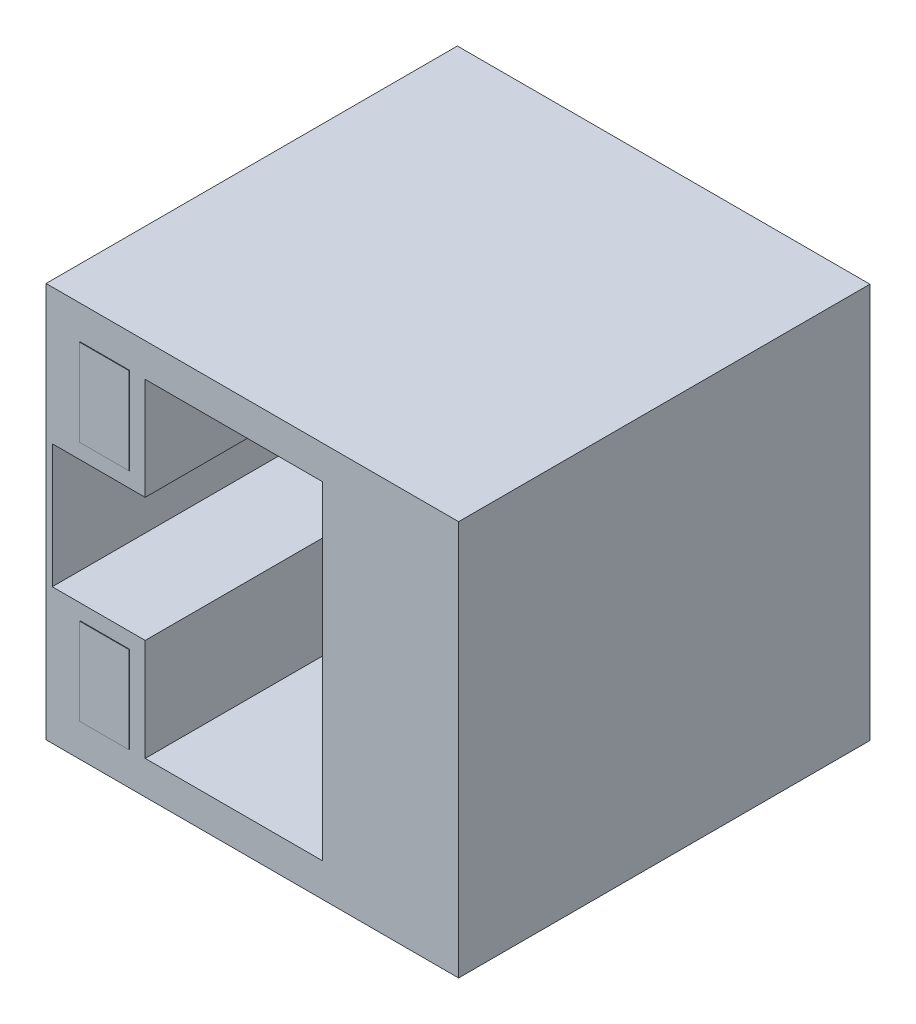
ISO-10303-21;
HEADER;
FILE_DESCRIPTION(('STEP AP214'),'2;1');
FILE_NAME('part.step','',(''),(''),'','','');
FILE_SCHEMA(('AUTOMOTIVE_DESIGN { 1 0 10303 214 1 1 1 1 }'));
ENDSEC;
DATA;
#1=APPLICATION_CONTEXT('core data for automotive mechanical design processes');
#2=APPLICATION_PROTOCOL_DEFINITION('international standard','automotive_design',2000,#1);
#3=PRODUCT_CONTEXT('',#1,'mechanical');
#4=PRODUCT('Part','Part','',(#3));
#5=PRODUCT_RELATED_PRODUCT_CATEGORY('part','',(#4));
#6=PRODUCT_DEFINITION_FORMATION('','',#4);
#7=PRODUCT_DEFINITION_CONTEXT('part definition',#1,'design');
#8=PRODUCT_DEFINITION('design','',#6,#7);
#9=PRODUCT_DEFINITION_SHAPE('','',#8);
#10=(LENGTH_UNIT() NAMED_UNIT(*) SI_UNIT(.MILLI.,.METRE.));
#11=(NAMED_UNIT(*) PLANE_ANGLE_UNIT() SI_UNIT($,.RADIAN.));
#12=(NAMED_UNIT(*) SI_UNIT($,.STERADIAN.) SOLID_ANGLE_UNIT());
#13=UNCERTAINTY_MEASURE_WITH_UNIT(LENGTH_MEASURE(1.E-05),#10,'distance_accuracy_value','');
#14=(GEOMETRIC_REPRESENTATION_CONTEXT(3) GLOBAL_UNCERTAINTY_ASSIGNED_CONTEXT((#13)) GLOBAL_UNIT_ASSIGNED_CONTEXT((#10,
#11,#12)) REPRESENTATION_CONTEXT('',''));
#15=CARTESIAN_POINT('',(0.,0.,0.));
#16=DIRECTION('',(0.,0.,1.));
#17=DIRECTION('',(1.,0.,0.));
#18=AXIS2_PLACEMENT_3D('',#15,#16,#17);
#19=CARTESIAN_POINT('',(-7.0612,-6.731,8.4582));
#20=DIRECTION('',(0.,0.,1.));
#21=DIRECTION('',(1.,0.,0.));
#22=AXIS2_PLACEMENT_3D('',#19,#20,#21);
#23=PLANE('',#22);
#24=DIRECTION('',(0.,1.,0.));
#25=VECTOR('',#24,1.);
#26=CARTESIAN_POINT('',(-7.0612,-4.953,8.4582));
#27=LINE('',#26,#25);
#28=CARTESIAN_POINT('',(-7.0612,-6.731,8.4582));
#29=VERTEX_POINT('',#28);
#30=CARTESIAN_POINT('',(-7.0612,-3.175,8.4582));
#31=VERTEX_POINT('',#30);
#32=EDGE_CURVE('E152',#29,#31,#27,.T.);
#33=ORIENTED_EDGE('',*,*,#32,.F.);
#34=DIRECTION('',(-1.,0.,0.));
#35=VECTOR('',#34,1.);
#36=CARTESIAN_POINT('',(-6.0452,-6.731,8.4582));
#37=LINE('',#36,#35);
#38=CARTESIAN_POINT('',(-5.0292,-6.731,8.4582));
#39=VERTEX_POINT('',#38);
#40=EDGE_CURVE('E154',#39,#29,#37,.T.);
#41=ORIENTED_EDGE('',*,*,#40,.F.);
#42=DIRECTION('',(0.,-1.,0.));
#43=VECTOR('',#42,1.);
#44=CARTESIAN_POINT('',(-5.0292,-4.953,8.4582));
#45=LINE('',#44,#43);
#46=CARTESIAN_POINT('',(-5.0292,-3.175,8.4582));
#47=VERTEX_POINT('',#46);
#48=EDGE_CURVE('E21',#47,#39,#45,.T.);
#49=ORIENTED_EDGE('',*,*,#48,.F.);
#50=DIRECTION('',(1.,0.,0.));
#51=VECTOR('',#50,1.);
#52=CARTESIAN_POINT('',(-6.0452,-3.175,8.4582));
#53=LINE('',#52,#51);
#54=EDGE_CURVE('E176',#31,#47,#53,.T.);
#55=ORIENTED_EDGE('',*,*,#54,.F.);
#56=EDGE_LOOP('',(#33,#41,#49,#55));
#57=FACE_BOUND('',#56,.T.);
#58=ADVANCED_FACE('F17',(#57),#23,.T.);
#59=CARTESIAN_POINT('',(-6.0452,4.953,8.4582));
#60=DIRECTION('',(0.,0.,1.));
#61=DIRECTION('',(1.,0.,0.));
#62=AXIS2_PLACEMENT_3D('',#59,#60,#61);
#63=PLANE('',#62);
#64=DIRECTION('',(0.,1.,0.));
#65=VECTOR('',#64,1.);
#66=CARTESIAN_POINT('',(-7.0612,3.175,8.4582));
#67=LINE('',#66,#65);
#68=CARTESIAN_POINT('',(-7.0612,3.175,8.4582));
#69=VERTEX_POINT('',#68);
#70=CARTESIAN_POINT('',(-7.0612,6.731,8.4582));
#71=VERTEX_POINT('',#70);
#72=EDGE_CURVE('E191',#69,#71,#67,.T.);
#73=ORIENTED_EDGE('',*,*,#72,.F.);
#74=DIRECTION('',(1.,0.,0.));
#75=VECTOR('',#74,1.);
#76=CARTESIAN_POINT('',(-5.0292,3.175,8.4582));
#77=LINE('',#76,#75);
#78=CARTESIAN_POINT('',(-5.0292,3.175,8.4582));
#79=VERTEX_POINT('',#78);
#80=EDGE_CURVE('E185',#79,#69,#77,.F.);
#81=ORIENTED_EDGE('',*,*,#80,.F.);
#82=DIRECTION('',(0.,1.,0.));
#83=VECTOR('',#82,1.);
#84=CARTESIAN_POINT('',(-5.0292,6.731,8.4582));
#85=LINE('',#84,#83);
#86=CARTESIAN_POINT('',(-5.0292,6.731,8.4582));
#87=VERTEX_POINT('',#86);
#88=EDGE_CURVE('E182',#87,#79,#85,.F.);
#89=ORIENTED_EDGE('',*,*,#88,.F.);
#90=DIRECTION('',(1.,0.,0.));
#91=VECTOR('',#90,1.);
#92=CARTESIAN_POINT('',(-7.0612,6.731,8.4582));
#93=LINE('',#92,#91);
#94=EDGE_CURVE('E197',#71,#87,#93,.T.);
#95=ORIENTED_EDGE('',*,*,#94,.F.);
#96=EDGE_LOOP('',(#73,#81,#89,#95));
#97=FACE_BOUND('',#96,.T.);
#98=ADVANCED_FACE('F504',(#97),#63,.T.);
#99=CARTESIAN_POINT('',(-2.01622360248448,0.,-1.7272));
#100=DIRECTION('',(0.,0.,1.));
#101=DIRECTION('',(1.,0.,0.));
#102=AXIS2_PLACEMENT_3D('',#99,#100,#101);
#103=PLANE('',#102);
#104=DIRECTION('',(1.,0.,0.));
#105=VECTOR('',#104,1.);
#106=CARTESIAN_POINT('',(-4.3942,2.54,-1.7272));
#107=LINE('',#106,#105);
#108=CARTESIAN_POINT('',(-4.3942,2.54,-1.7272));
#109=VERTEX_POINT('',#108);
#110=CARTESIAN_POINT('',(-8.2042,2.54,-1.7272));
#111=VERTEX_POINT('',#110);
#112=EDGE_CURVE('E215',#109,#111,#107,.F.);
#113=ORIENTED_EDGE('',*,*,#112,.T.);
#114=DIRECTION('',(0.,1.,0.));
#115=VECTOR('',#114,1.);
#116=CARTESIAN_POINT('',(-8.2042,2.54,-1.7272));
#117=LINE('',#116,#115);
#118=CARTESIAN_POINT('',(-8.2042,-2.54,-1.7272));
#119=VERTEX_POINT('',#118);
#120=EDGE_CURVE('E210',#111,#119,#117,.F.);
#121=ORIENTED_EDGE('',*,*,#120,.T.);
#122=DIRECTION('',(1.,0.,0.));
#123=VECTOR('',#122,1.);
#124=CARTESIAN_POINT('',(-8.2042,-2.54,-1.7272));
#125=LINE('',#124,#123);
#126=CARTESIAN_POINT('',(-4.3942,-2.54,-1.7272));
#127=VERTEX_POINT('',#126);
#128=EDGE_CURVE('E206',#119,#127,#125,.T.);
#129=ORIENTED_EDGE('',*,*,#128,.T.);
#130=DIRECTION('',(0.,1.,0.));
#131=VECTOR('',#130,1.);
#132=CARTESIAN_POINT('',(-4.3942,-2.54,-1.7272));
#133=LINE('',#132,#131);
#134=CARTESIAN_POINT('',(-4.3942,-6.731,-1.7272));
#135=VERTEX_POINT('',#134);
#136=EDGE_CURVE('E243',#127,#135,#133,.F.);
#137=ORIENTED_EDGE('',*,*,#136,.T.);
#138=DIRECTION('',(1.,0.,0.));
#139=VECTOR('',#138,1.);
#140=CARTESIAN_POINT('',(-4.3942,-6.731,-1.7272));
#141=LINE('',#140,#139);
#142=CARTESIAN_POINT('',(2.8702,-6.731,-1.7272));
#143=VERTEX_POINT('',#142);
#144=EDGE_CURVE('E235',#135,#143,#141,.T.);
#145=ORIENTED_EDGE('',*,*,#144,.T.);
#146=DIRECTION('',(0.,1.,0.));
#147=VECTOR('',#146,1.);
#148=CARTESIAN_POINT('',(2.8702,-6.731,-1.7272));
#149=LINE('',#148,#147);
#150=CARTESIAN_POINT('',(2.8702,6.731,-1.7272));
#151=VERTEX_POINT('',#150);
#152=EDGE_CURVE('E230',#143,#151,#149,.T.);
#153=ORIENTED_EDGE('',*,*,#152,.T.);
#154=DIRECTION('',(1.,0.,0.));
#155=VECTOR('',#154,1.);
#156=CARTESIAN_POINT('',(2.8702,6.731,-1.7272));
#157=LINE('',#156,#155);
#158=CARTESIAN_POINT('',(-4.3942,6.731,-1.7272));
#159=VERTEX_POINT('',#158);
#160=EDGE_CURVE('E225',#151,#159,#157,.F.);
#161=ORIENTED_EDGE('',*,*,#160,.T.);
#162=DIRECTION('',(0.,1.,0.));
#163=VECTOR('',#162,1.);
#164=CARTESIAN_POINT('',(-4.3942,6.731,-1.7272));
#165=LINE('',#164,#163);
#166=EDGE_CURVE('E220',#159,#109,#165,.F.);
#167=ORIENTED_EDGE('',*,*,#166,.T.);
#168=EDGE_LOOP('',(#113,#121,#129,#137,#145,#153,#161,#167));
#169=FACE_BOUND('',#168,.T.);
#170=ADVANCED_FACE('F497',(#169),#103,.T.);
#171=CARTESIAN_POINT('',(-5.0292,-6.731,8.4582));
#172=DIRECTION('',(1.,0.,0.));
#173=DIRECTION('',(0.,0.,-1.));
#174=AXIS2_PLACEMENT_3D('',#171,#172,#173);
#175=PLANE('',#174);
#176=DIRECTION('',(0.,1.,0.));
#177=VECTOR('',#176,1.);
#178=CARTESIAN_POINT('',(-5.0292,0.,8.4328));
#179=LINE('',#178,#177);
#180=CARTESIAN_POINT('',(-5.0292,-3.175,8.4328));
#181=VERTEX_POINT('',#180);
#182=CARTESIAN_POINT('',(-5.0292,-6.731,8.4328));
#183=VERTEX_POINT('',#182);
#184=EDGE_CURVE('E248',#181,#183,#179,.F.);
#185=ORIENTED_EDGE('',*,*,#184,.F.);
#186=DIRECTION('',(0.,0.,-1.));
#187=VECTOR('',#186,1.);
#188=CARTESIAN_POINT('',(-5.0292,-3.175,8.4455));
#189=LINE('',#188,#187);
#190=EDGE_CURVE('E165',#47,#181,#189,.T.);
#191=ORIENTED_EDGE('',*,*,#190,.F.);
#192=ORIENTED_EDGE('',*,*,#48,.T.);
#193=DIRECTION('',(0.,0.,1.));
#194=VECTOR('',#193,1.);
#195=CARTESIAN_POINT('',(-5.0292,-6.731,8.4455));
#196=LINE('',#195,#194);
#197=EDGE_CURVE('E160',#183,#39,#196,.T.);
#198=ORIENTED_EDGE('',*,*,#197,.F.);
#199=EDGE_LOOP('',(#185,#191,#192,#198));
#200=FACE_BOUND('',#199,.T.);
#201=ADVANCED_FACE('F162',(#200),#175,.T.);
#202=CARTESIAN_POINT('',(-5.0292,-6.731,8.4328));
#203=DIRECTION('',(0.,-1.,0.));
#204=DIRECTION('',(0.,0.,1.));
#205=AXIS2_PLACEMENT_3D('',#202,#203,#204);
#206=PLANE('',#205);
#207=DIRECTION('',(1.,0.,0.));
#208=VECTOR('',#207,1.);
#209=CARTESIAN_POINT('',(0.,-6.731,8.4328));
#210=LINE('',#209,#208);
#211=CARTESIAN_POINT('',(-7.0612,-6.731,8.4328));
#212=VERTEX_POINT('',#211);
#213=EDGE_CURVE('E169',#183,#212,#210,.F.);
#214=ORIENTED_EDGE('',*,*,#213,.F.);
#215=ORIENTED_EDGE('',*,*,#197,.T.);
#216=ORIENTED_EDGE('',*,*,#40,.T.);
#217=DIRECTION('',(0.,0.,1.));
#218=VECTOR('',#217,1.);
#219=CARTESIAN_POINT('',(-7.0612,-6.731,8.4455));
#220=LINE('',#219,#218);
#221=EDGE_CURVE('E172',#212,#29,#220,.T.);
#222=ORIENTED_EDGE('',*,*,#221,.F.);
#223=EDGE_LOOP('',(#214,#215,#216,#222));
#224=FACE_BOUND('',#223,.T.);
#225=ADVANCED_FACE('F167',(#224),#206,.T.);
#226=CARTESIAN_POINT('',(-7.0612,-6.731,8.4328));
#227=DIRECTION('',(-1.,0.,0.));
#228=DIRECTION('',(0.,0.,1.));
#229=AXIS2_PLACEMENT_3D('',#226,#227,#228);
#230=PLANE('',#229);
#231=DIRECTION('',(0.,1.,0.));
#232=VECTOR('',#231,1.);
#233=CARTESIAN_POINT('',(-7.0612,0.,8.4328));
#234=LINE('',#233,#232);
#235=CARTESIAN_POINT('',(-7.0612,-3.175,8.4328));
#236=VERTEX_POINT('',#235);
#237=EDGE_CURVE('E251',#212,#236,#234,.T.);
#238=ORIENTED_EDGE('',*,*,#237,.F.);
#239=ORIENTED_EDGE('',*,*,#221,.T.);
#240=ORIENTED_EDGE('',*,*,#32,.T.);
#241=DIRECTION('',(0.,0.,1.));
#242=VECTOR('',#241,1.);
#243=CARTESIAN_POINT('',(-7.0612,-3.175,8.4455));
#244=LINE('',#243,#242);
#245=EDGE_CURVE('E179',#236,#31,#244,.T.);
#246=ORIENTED_EDGE('',*,*,#245,.F.);
#247=EDGE_LOOP('',(#238,#239,#240,#246));
#248=FACE_BOUND('',#247,.T.);
#249=ADVANCED_FACE('F478',(#248),#230,.T.);
#250=CARTESIAN_POINT('',(-5.0292,-3.175,8.4582));
#251=DIRECTION('',(0.,1.,0.));
#252=DIRECTION('',(0.,0.,-1.));
#253=AXIS2_PLACEMENT_3D('',#250,#251,#252);
#254=PLANE('',#253);
#255=DIRECTION('',(1.,0.,0.));
#256=VECTOR('',#255,1.);
#257=CARTESIAN_POINT('',(0.,-3.175,8.4328));
#258=LINE('',#257,#256);
#259=EDGE_CURVE('E254',#236,#181,#258,.T.);
#260=ORIENTED_EDGE('',*,*,#259,.F.);
#261=ORIENTED_EDGE('',*,*,#245,.T.);
#262=ORIENTED_EDGE('',*,*,#54,.T.);
#263=ORIENTED_EDGE('',*,*,#190,.T.);
#264=EDGE_LOOP('',(#260,#261,#262,#263));
#265=FACE_BOUND('',#264,.T.);
#266=ADVANCED_FACE('F19',(#265),#254,.T.);
#267=CARTESIAN_POINT('',(-5.0292,6.731,8.4328));
#268=DIRECTION('',(1.,0.,0.));
#269=DIRECTION('',(0.,0.,-1.));
#270=AXIS2_PLACEMENT_3D('',#267,#268,#269);
#271=PLANE('',#270);
#272=DIRECTION('',(0.,1.,0.));
#273=VECTOR('',#272,1.);
#274=CARTESIAN_POINT('',(-5.0292,0.,8.4328));
#275=LINE('',#274,#273);
#276=CARTESIAN_POINT('',(-5.0292,6.731,8.4328));
#277=VERTEX_POINT('',#276);
#278=CARTESIAN_POINT('',(-5.0292,3.175,8.4328));
#279=VERTEX_POINT('',#278);
#280=EDGE_CURVE('E257',#277,#279,#275,.F.);
#281=ORIENTED_EDGE('',*,*,#280,.F.);
#282=DIRECTION('',(0.,0.,1.));
#283=VECTOR('',#282,1.);
#284=CARTESIAN_POINT('',(-5.0292,6.731,8.4328));
#285=LINE('',#284,#283);
#286=EDGE_CURVE('E200',#87,#277,#285,.F.);
#287=ORIENTED_EDGE('',*,*,#286,.F.);
#288=ORIENTED_EDGE('',*,*,#88,.T.);
#289=DIRECTION('',(0.,0.,-1.));
#290=VECTOR('',#289,1.);
#291=CARTESIAN_POINT('',(-5.0292,3.175,8.4328));
#292=LINE('',#291,#290);
#293=EDGE_CURVE('E188',#279,#79,#292,.F.);
#294=ORIENTED_EDGE('',*,*,#293,.F.);
#295=EDGE_LOOP('',(#281,#287,#288,#294));
#296=FACE_BOUND('',#295,.T.);
#297=ADVANCED_FACE('F463',(#296),#271,.T.);
#298=CARTESIAN_POINT('',(-5.0292,3.175,8.4328));
#299=DIRECTION('',(0.,-1.,0.));
#300=DIRECTION('',(0.,0.,-1.));
#301=AXIS2_PLACEMENT_3D('',#298,#299,#300);
#302=PLANE('',#301);
#303=DIRECTION('',(1.,0.,0.));
#304=VECTOR('',#303,1.);
#305=CARTESIAN_POINT('',(0.,3.175,8.4328));
#306=LINE('',#305,#304);
#307=CARTESIAN_POINT('',(-7.0612,3.175,8.4328));
#308=VERTEX_POINT('',#307);
#309=EDGE_CURVE('E260',#279,#308,#306,.F.);
#310=ORIENTED_EDGE('',*,*,#309,.F.);
#311=ORIENTED_EDGE('',*,*,#293,.T.);
#312=ORIENTED_EDGE('',*,*,#80,.T.);
#313=DIRECTION('',(0.,0.,1.));
#314=VECTOR('',#313,1.);
#315=CARTESIAN_POINT('',(-7.0612,3.175,8.4328));
#316=LINE('',#315,#314);
#317=EDGE_CURVE('E194',#308,#69,#316,.T.);
#318=ORIENTED_EDGE('',*,*,#317,.F.);
#319=EDGE_LOOP('',(#310,#311,#312,#318));
#320=FACE_BOUND('',#319,.T.);
#321=ADVANCED_FACE('F455',(#320),#302,.T.);
#322=CARTESIAN_POINT('',(-7.0612,3.175,8.4328));
#323=DIRECTION('',(-1.,0.,0.));
#324=DIRECTION('',(0.,0.,1.));
#325=AXIS2_PLACEMENT_3D('',#322,#323,#324);
#326=PLANE('',#325);
#327=DIRECTION('',(0.,1.,0.));
#328=VECTOR('',#327,1.);
#329=CARTESIAN_POINT('',(-7.0612,0.,8.4328));
#330=LINE('',#329,#328);
#331=CARTESIAN_POINT('',(-7.0612,6.731,8.4328));
#332=VERTEX_POINT('',#331);
#333=EDGE_CURVE('E263',#308,#332,#330,.T.);
#334=ORIENTED_EDGE('',*,*,#333,.F.);
#335=ORIENTED_EDGE('',*,*,#317,.T.);
#336=ORIENTED_EDGE('',*,*,#72,.T.);
#337=DIRECTION('',(0.,0.,1.));
#338=VECTOR('',#337,1.);
#339=CARTESIAN_POINT('',(-7.0612,6.731,8.4328));
#340=LINE('',#339,#338);
#341=EDGE_CURVE('E203',#332,#71,#340,.T.);
#342=ORIENTED_EDGE('',*,*,#341,.F.);
#343=EDGE_LOOP('',(#334,#335,#336,#342));
#344=FACE_BOUND('',#343,.T.);
#345=ADVANCED_FACE('F447',(#344),#326,.T.);
#346=CARTESIAN_POINT('',(-7.0612,6.731,8.4328));
#347=DIRECTION('',(0.,1.,0.));
#348=DIRECTION('',(0.,0.,1.));
#349=AXIS2_PLACEMENT_3D('',#346,#347,#348);
#350=PLANE('',#349);
#351=DIRECTION('',(1.,0.,0.));
#352=VECTOR('',#351,1.);
#353=CARTESIAN_POINT('',(0.,6.731,8.4328));
#354=LINE('',#353,#352);
#355=EDGE_CURVE('E266',#332,#277,#354,.T.);
#356=ORIENTED_EDGE('',*,*,#355,.F.);
#357=ORIENTED_EDGE('',*,*,#341,.T.);
#358=ORIENTED_EDGE('',*,*,#94,.T.);
#359=ORIENTED_EDGE('',*,*,#286,.T.);
#360=EDGE_LOOP('',(#356,#357,#358,#359));
#361=FACE_BOUND('',#360,.T.);
#362=ADVANCED_FACE('F439',(#361),#350,.T.);
#363=CARTESIAN_POINT('',(-8.2042,-2.54,8.4328));
#364=DIRECTION('',(0.,-1.,0.));
#365=DIRECTION('',(0.,0.,-1.));
#366=AXIS2_PLACEMENT_3D('',#363,#364,#365);
#367=PLANE('',#366);
#368=DIRECTION('',(0.,0.,1.));
#369=VECTOR('',#368,1.);
#370=CARTESIAN_POINT('',(-8.2042,-2.54,8.4328));
#371=LINE('',#370,#369);
#372=CARTESIAN_POINT('',(-8.2042,-2.54,8.4328));
#373=VERTEX_POINT('',#372);
#374=EDGE_CURVE('E208',#119,#373,#371,.T.);
#375=ORIENTED_EDGE('',*,*,#374,.T.);
#376=DIRECTION('',(1.,0.,0.));
#377=VECTOR('',#376,1.);
#378=CARTESIAN_POINT('',(0.,-2.54,8.4328));
#379=LINE('',#378,#377);
#380=CARTESIAN_POINT('',(-4.3942,-2.54,8.4328));
#381=VERTEX_POINT('',#380);
#382=EDGE_CURVE('E269',#381,#373,#379,.F.);
#383=ORIENTED_EDGE('',*,*,#382,.F.);
#384=DIRECTION('',(0.,0.,1.));
#385=VECTOR('',#384,1.);
#386=CARTESIAN_POINT('',(-4.3942,-2.54,8.4328));
#387=LINE('',#386,#385);
#388=EDGE_CURVE('E240',#381,#127,#387,.F.);
#389=ORIENTED_EDGE('',*,*,#388,.T.);
#390=ORIENTED_EDGE('',*,*,#128,.F.);
#391=EDGE_LOOP('',(#375,#383,#389,#390));
#392=FACE_BOUND('',#391,.T.);
#393=ADVANCED_FACE('F431',(#392),#367,.F.);
#394=CARTESIAN_POINT('',(-8.2042,2.54,8.4328));
#395=DIRECTION('',(-1.,0.,0.));
#396=DIRECTION('',(0.,0.,1.));
#397=AXIS2_PLACEMENT_3D('',#394,#395,#396);
#398=PLANE('',#397);
#399=DIRECTION('',(0.,0.,1.));
#400=VECTOR('',#399,1.);
#401=CARTESIAN_POINT('',(-8.2042,2.54,8.4328));
#402=LINE('',#401,#400);
#403=CARTESIAN_POINT('',(-8.2042,2.54,8.4328));
#404=VERTEX_POINT('',#403);
#405=EDGE_CURVE('E213',#111,#404,#402,.T.);
#406=ORIENTED_EDGE('',*,*,#405,.T.);
#407=DIRECTION('',(0.,1.,0.));
#408=VECTOR('',#407,1.);
#409=CARTESIAN_POINT('',(-8.2042,0.,8.4328));
#410=LINE('',#409,#408);
#411=EDGE_CURVE('E272',#373,#404,#410,.T.);
#412=ORIENTED_EDGE('',*,*,#411,.F.);
#413=ORIENTED_EDGE('',*,*,#374,.F.);
#414=ORIENTED_EDGE('',*,*,#120,.F.);
#415=EDGE_LOOP('',(#406,#412,#413,#414));
#416=FACE_BOUND('',#415,.T.);
#417=ADVANCED_FACE('F423',(#416),#398,.F.);
#418=CARTESIAN_POINT('',(-4.3942,2.54,8.4328));
#419=DIRECTION('',(0.,1.,0.));
#420=DIRECTION('',(0.,0.,1.));
#421=AXIS2_PLACEMENT_3D('',#418,#419,#420);
#422=PLANE('',#421);
#423=DIRECTION('',(0.,0.,1.));
#424=VECTOR('',#423,1.);
#425=CARTESIAN_POINT('',(-4.3942,2.54,8.4328));
#426=LINE('',#425,#424);
#427=CARTESIAN_POINT('',(-4.3942,2.54,8.4328));
#428=VERTEX_POINT('',#427);
#429=EDGE_CURVE('E218',#109,#428,#426,.T.);
#430=ORIENTED_EDGE('',*,*,#429,.T.);
#431=DIRECTION('',(1.,0.,0.));
#432=VECTOR('',#431,1.);
#433=CARTESIAN_POINT('',(0.,2.54,8.4328));
#434=LINE('',#433,#432);
#435=EDGE_CURVE('E275',#404,#428,#434,.T.);
#436=ORIENTED_EDGE('',*,*,#435,.F.);
#437=ORIENTED_EDGE('',*,*,#405,.F.);
#438=ORIENTED_EDGE('',*,*,#112,.F.);
#439=EDGE_LOOP('',(#430,#436,#437,#438));
#440=FACE_BOUND('',#439,.T.);
#441=ADVANCED_FACE('F415',(#440),#422,.F.);
#442=CARTESIAN_POINT('',(-4.3942,6.731,8.4328));
#443=DIRECTION('',(-1.,0.,0.));
#444=DIRECTION('',(0.,0.,1.));
#445=AXIS2_PLACEMENT_3D('',#442,#443,#444);
#446=PLANE('',#445);
#447=DIRECTION('',(0.,0.,1.));
#448=VECTOR('',#447,1.);
#449=CARTESIAN_POINT('',(-4.3942,6.731,8.4328));
#450=LINE('',#449,#448);
#451=CARTESIAN_POINT('',(-4.3942,6.731,8.4328));
#452=VERTEX_POINT('',#451);
#453=EDGE_CURVE('E223',#159,#452,#450,.T.);
#454=ORIENTED_EDGE('',*,*,#453,.T.);
#455=DIRECTION('',(0.,1.,0.));
#456=VECTOR('',#455,1.);
#457=CARTESIAN_POINT('',(-4.3942,0.,8.4328));
#458=LINE('',#457,#456);
#459=EDGE_CURVE('E278',#428,#452,#458,.T.);
#460=ORIENTED_EDGE('',*,*,#459,.F.);
#461=ORIENTED_EDGE('',*,*,#429,.F.);
#462=ORIENTED_EDGE('',*,*,#166,.F.);
#463=EDGE_LOOP('',(#454,#460,#461,#462));
#464=FACE_BOUND('',#463,.T.);
#465=ADVANCED_FACE('F407',(#464),#446,.F.);
#466=CARTESIAN_POINT('',(2.8702,6.731,8.4328));
#467=DIRECTION('',(0.,1.,0.));
#468=DIRECTION('',(0.,0.,1.));
#469=AXIS2_PLACEMENT_3D('',#466,#467,#468);
#470=PLANE('',#469);
#471=DIRECTION('',(0.,0.,-1.));
#472=VECTOR('',#471,1.);
#473=CARTESIAN_POINT('',(2.8702,6.731,8.4328));
#474=LINE('',#473,#472);
#475=CARTESIAN_POINT('',(2.8702,6.731,8.4328));
#476=VERTEX_POINT('',#475);
#477=EDGE_CURVE('E228',#151,#476,#474,.F.);
#478=ORIENTED_EDGE('',*,*,#477,.T.);
#479=DIRECTION('',(1.,0.,0.));
#480=VECTOR('',#479,1.);
#481=CARTESIAN_POINT('',(0.,6.731,8.4328));
#482=LINE('',#481,#480);
#483=EDGE_CURVE('E281',#452,#476,#482,.T.);
#484=ORIENTED_EDGE('',*,*,#483,.F.);
#485=ORIENTED_EDGE('',*,*,#453,.F.);
#486=ORIENTED_EDGE('',*,*,#160,.F.);
#487=EDGE_LOOP('',(#478,#484,#485,#486));
#488=FACE_BOUND('',#487,.T.);
#489=ADVANCED_FACE('F399',(#488),#470,.F.);
#490=CARTESIAN_POINT('',(2.8702,-6.731,8.4328));
#491=DIRECTION('',(1.,0.,0.));
#492=DIRECTION('',(0.,0.,-1.));
#493=AXIS2_PLACEMENT_3D('',#490,#491,#492);
#494=PLANE('',#493);
#495=DIRECTION('',(0.,0.,-1.));
#496=VECTOR('',#495,1.);
#497=CARTESIAN_POINT('',(2.8702,-6.731,8.4328));
#498=LINE('',#497,#496);
#499=CARTESIAN_POINT('',(2.8702,-6.731,8.4328));
#500=VERTEX_POINT('',#499);
#501=EDGE_CURVE('E233',#143,#500,#498,.F.);
#502=ORIENTED_EDGE('',*,*,#501,.T.);
#503=DIRECTION('',(0.,1.,0.));
#504=VECTOR('',#503,1.);
#505=CARTESIAN_POINT('',(2.8702,0.,8.4328));
#506=LINE('',#505,#504);
#507=EDGE_CURVE('E284',#476,#500,#506,.F.);
#508=ORIENTED_EDGE('',*,*,#507,.F.);
#509=ORIENTED_EDGE('',*,*,#477,.F.);
#510=ORIENTED_EDGE('',*,*,#152,.F.);
#511=EDGE_LOOP('',(#502,#508,#509,#510));
#512=FACE_BOUND('',#511,.T.);
#513=ADVANCED_FACE('F391',(#512),#494,.F.);
#514=CARTESIAN_POINT('',(-4.3942,-6.731,8.4328));
#515=DIRECTION('',(0.,-1.,0.));
#516=DIRECTION('',(0.,0.,-1.));
#517=AXIS2_PLACEMENT_3D('',#514,#515,#516);
#518=PLANE('',#517);
#519=DIRECTION('',(0.,0.,1.));
#520=VECTOR('',#519,1.);
#521=CARTESIAN_POINT('',(-4.3942,-6.731,8.4328));
#522=LINE('',#521,#520);
#523=CARTESIAN_POINT('',(-4.3942,-6.731,8.4328));
#524=VERTEX_POINT('',#523);
#525=EDGE_CURVE('E238',#135,#524,#522,.T.);
#526=ORIENTED_EDGE('',*,*,#525,.T.);
#527=DIRECTION('',(1.,0.,0.));
#528=VECTOR('',#527,1.);
#529=CARTESIAN_POINT('',(0.,-6.731,8.4328));
#530=LINE('',#529,#528);
#531=EDGE_CURVE('E287',#500,#524,#530,.F.);
#532=ORIENTED_EDGE('',*,*,#531,.F.);
#533=ORIENTED_EDGE('',*,*,#501,.F.);
#534=ORIENTED_EDGE('',*,*,#144,.F.);
#535=EDGE_LOOP('',(#526,#532,#533,#534));
#536=FACE_BOUND('',#535,.T.);
#537=ADVANCED_FACE('F383',(#536),#518,.F.);
#538=CARTESIAN_POINT('',(-4.3942,-2.54,8.4328));
#539=DIRECTION('',(-1.,0.,0.));
#540=DIRECTION('',(0.,0.,1.));
#541=AXIS2_PLACEMENT_3D('',#538,#539,#540);
#542=PLANE('',#541);
#543=ORIENTED_EDGE('',*,*,#388,.F.);
#544=DIRECTION('',(0.,1.,0.));
#545=VECTOR('',#544,1.);
#546=CARTESIAN_POINT('',(-4.3942,0.,8.4328));
#547=LINE('',#546,#545);
#548=EDGE_CURVE('E290',#524,#381,#547,.T.);
#549=ORIENTED_EDGE('',*,*,#548,.F.);
#550=ORIENTED_EDGE('',*,*,#525,.F.);
#551=ORIENTED_EDGE('',*,*,#136,.F.);
#552=EDGE_LOOP('',(#543,#549,#550,#551));
#553=FACE_BOUND('',#552,.T.);
#554=ADVANCED_FACE('F342',(#553),#542,.F.);
#555=CARTESIAN_POINT('',(-8.4582,8.1026,0.));
#556=DIRECTION('',(0.,1.,0.));
#557=DIRECTION('',(0.,0.,1.));
#558=AXIS2_PLACEMENT_3D('',#555,#556,#557);
#559=PLANE('',#558);
#560=DIRECTION('',(1.,0.,0.));
#561=VECTOR('',#560,1.);
#562=CARTESIAN_POINT('',(0.,8.1026,-8.4328));
#563=LINE('',#562,#561);
#564=CARTESIAN_POINT('',(8.4582,8.1026,-8.4328));
#565=VERTEX_POINT('',#564);
#566=CARTESIAN_POINT('',(-8.4582,8.1026,-8.4328));
#567=VERTEX_POINT('',#566);
#568=EDGE_CURVE('E299',#565,#567,#563,.F.);
#569=ORIENTED_EDGE('',*,*,#568,.T.);
#570=DIRECTION('',(0.,0.,1.));
#571=VECTOR('',#570,1.);
#572=CARTESIAN_POINT('',(-8.4582,8.1026,0.));
#573=LINE('',#572,#571);
#574=CARTESIAN_POINT('',(-8.4582,8.1026,8.4328));
#575=VERTEX_POINT('',#574);
#576=EDGE_CURVE('E296',#575,#567,#573,.F.);
#577=ORIENTED_EDGE('',*,*,#576,.F.);
#578=DIRECTION('',(1.,0.,0.));
#579=VECTOR('',#578,1.);
#580=CARTESIAN_POINT('',(0.,8.1026,8.4328));
#581=LINE('',#580,#579);
#582=CARTESIAN_POINT('',(8.4582,8.1026,8.4328));
#583=VERTEX_POINT('',#582);
#584=EDGE_CURVE('E246',#583,#575,#581,.F.);
#585=ORIENTED_EDGE('',*,*,#584,.F.);
#586=DIRECTION('',(0.,0.,-1.));
#587=VECTOR('',#586,1.);
#588=CARTESIAN_POINT('',(8.4582,8.1026,0.));
#589=LINE('',#588,#587);
#590=EDGE_CURVE('E307',#565,#583,#589,.F.);
#591=ORIENTED_EDGE('',*,*,#590,.F.);
#592=EDGE_LOOP('',(#569,#577,#585,#591));
#593=FACE_BOUND('',#592,.T.);
#594=ADVANCED_FACE('F327',(#593),#559,.T.);
#595=CARTESIAN_POINT('',(0.,0.,8.4328));
#596=DIRECTION('',(0.,0.,1.));
#597=DIRECTION('',(1.,0.,0.));
#598=AXIS2_PLACEMENT_3D('',#595,#596,#597);
#599=PLANE('',#598);
#600=ORIENTED_EDGE('',*,*,#531,.T.);
#601=ORIENTED_EDGE('',*,*,#548,.T.);
#602=ORIENTED_EDGE('',*,*,#382,.T.);
#603=ORIENTED_EDGE('',*,*,#411,.T.);
#604=ORIENTED_EDGE('',*,*,#435,.T.);
#605=ORIENTED_EDGE('',*,*,#459,.T.);
#606=ORIENTED_EDGE('',*,*,#483,.T.);
#607=ORIENTED_EDGE('',*,*,#507,.T.);
#608=EDGE_LOOP('',(#600,#601,#602,#603,#604,#605,#606,#607));
#609=FACE_BOUND('',#608,.T.);
#610=ORIENTED_EDGE('',*,*,#333,.T.);
#611=ORIENTED_EDGE('',*,*,#355,.T.);
#612=ORIENTED_EDGE('',*,*,#280,.T.);
#613=ORIENTED_EDGE('',*,*,#309,.T.);
#614=EDGE_LOOP('',(#610,#611,#612,#613));
#615=FACE_BOUND('',#614,.T.);
#616=ORIENTED_EDGE('',*,*,#237,.T.);
#617=ORIENTED_EDGE('',*,*,#259,.T.);
#618=ORIENTED_EDGE('',*,*,#184,.T.);
#619=ORIENTED_EDGE('',*,*,#213,.T.);
#620=EDGE_LOOP('',(#616,#617,#618,#619));
#621=FACE_BOUND('',#620,.T.);
#622=DIRECTION('',(0.,1.,0.));
#623=VECTOR('',#622,1.);
#624=CARTESIAN_POINT('',(-8.4582,-8.1026,8.4328));
#625=LINE('',#624,#623);
#626=CARTESIAN_POINT('',(-8.4582,-8.1026,8.4328));
#627=VERTEX_POINT('',#626);
#628=EDGE_CURVE('E293',#627,#575,#625,.T.);
#629=ORIENTED_EDGE('',*,*,#628,.F.);
#630=DIRECTION('',(1.,0.,0.));
#631=VECTOR('',#630,1.);
#632=CARTESIAN_POINT('',(8.4582,-8.1026,8.4328));
#633=LINE('',#632,#631);
#634=CARTESIAN_POINT('',(8.4582,-8.1026,8.4328));
#635=VERTEX_POINT('',#634);
#636=EDGE_CURVE('E310',#635,#627,#633,.F.);
#637=ORIENTED_EDGE('',*,*,#636,.F.);
#638=DIRECTION('',(0.,1.,0.));
#639=VECTOR('',#638,1.);
#640=CARTESIAN_POINT('',(8.4582,8.1026,8.4328));
#641=LINE('',#640,#639);
#642=EDGE_CURVE('E303',#583,#635,#641,.F.);
#643=ORIENTED_EDGE('',*,*,#642,.F.);
#644=ORIENTED_EDGE('',*,*,#584,.T.);
#645=EDGE_LOOP('',(#629,#637,#643,#644));
#646=FACE_BOUND('',#645,.T.);
#647=ADVANCED_FACE('F332',(#609,#615,#621,#646),#599,.T.);
#648=CARTESIAN_POINT('',(-8.4582,-8.1026,0.));
#649=DIRECTION('',(-1.,0.,0.));
#650=DIRECTION('',(0.,0.,1.));
#651=AXIS2_PLACEMENT_3D('',#648,#649,#650);
#652=PLANE('',#651);
#653=DIRECTION('',(0.,1.,0.));
#654=VECTOR('',#653,1.);
#655=CARTESIAN_POINT('',(-8.4582,0.,-8.4328));
#656=LINE('',#655,#654);
#657=CARTESIAN_POINT('',(-8.4582,-8.1026,-8.4328));
#658=VERTEX_POINT('',#657);
#659=EDGE_CURVE('E301',#567,#658,#656,.F.);
#660=ORIENTED_EDGE('',*,*,#659,.T.);
#661=DIRECTION('',(0.,0.,-1.));
#662=VECTOR('',#661,1.);
#663=CARTESIAN_POINT('',(-8.4582,-8.1026,0.));
#664=LINE('',#663,#662);
#665=EDGE_CURVE('E313',#627,#658,#664,.T.);
#666=ORIENTED_EDGE('',*,*,#665,.F.);
#667=ORIENTED_EDGE('',*,*,#628,.T.);
#668=ORIENTED_EDGE('',*,*,#576,.T.);
#669=EDGE_LOOP('',(#660,#666,#667,#668));
#670=FACE_BOUND('',#669,.T.);
#671=ADVANCED_FACE('F324',(#670),#652,.T.);
#672=CARTESIAN_POINT('',(0.,0.,-8.4328));
#673=DIRECTION('',(0.,0.,1.));
#674=DIRECTION('',(1.,0.,0.));
#675=AXIS2_PLACEMENT_3D('',#672,#673,#674);
#676=PLANE('',#675);
#677=ORIENTED_EDGE('',*,*,#568,.F.);
#678=DIRECTION('',(0.,1.,0.));
#679=VECTOR('',#678,1.);
#680=CARTESIAN_POINT('',(8.4582,8.1026,-8.4328));
#681=LINE('',#680,#679);
#682=CARTESIAN_POINT('',(8.4582,-8.1026,-8.4328));
#683=VERTEX_POINT('',#682);
#684=EDGE_CURVE('E36',#683,#565,#681,.T.);
#685=ORIENTED_EDGE('',*,*,#684,.F.);
#686=DIRECTION('',(1.,0.,0.));
#687=VECTOR('',#686,1.);
#688=CARTESIAN_POINT('',(8.4582,-8.1026,-8.4328));
#689=LINE('',#688,#687);
#690=EDGE_CURVE('E27',#658,#683,#689,.T.);
#691=ORIENTED_EDGE('',*,*,#690,.F.);
#692=ORIENTED_EDGE('',*,*,#659,.F.);
#693=EDGE_LOOP('',(#677,#685,#691,#692));
#694=FACE_BOUND('',#693,.T.);
#695=ADVANCED_FACE('F321',(#694),#676,.F.);
#696=CARTESIAN_POINT('',(8.4582,8.1026,0.));
#697=DIRECTION('',(1.,0.,0.));
#698=DIRECTION('',(0.,0.,-1.));
#699=AXIS2_PLACEMENT_3D('',#696,#697,#698);
#700=PLANE('',#699);
#701=ORIENTED_EDGE('',*,*,#684,.T.);
#702=ORIENTED_EDGE('',*,*,#590,.T.);
#703=ORIENTED_EDGE('',*,*,#642,.T.);
#704=DIRECTION('',(0.,0.,-1.));
#705=VECTOR('',#704,1.);
#706=CARTESIAN_POINT('',(8.4582,-8.1026,0.));
#707=LINE('',#706,#705);
#708=EDGE_CURVE('E11',#683,#635,#707,.F.);
#709=ORIENTED_EDGE('',*,*,#708,.F.);
#710=EDGE_LOOP('',(#701,#702,#703,#709));
#711=FACE_BOUND('',#710,.T.);
#712=ADVANCED_FACE('F330',(#711),#700,.T.);
#713=CARTESIAN_POINT('',(8.4582,-8.1026,0.));
#714=DIRECTION('',(0.,-1.,0.));
#715=DIRECTION('',(0.,0.,-1.));
#716=AXIS2_PLACEMENT_3D('',#713,#714,#715);
#717=PLANE('',#716);
#718=ORIENTED_EDGE('',*,*,#690,.T.);
#719=ORIENTED_EDGE('',*,*,#708,.T.);
#720=ORIENTED_EDGE('',*,*,#636,.T.);
#721=ORIENTED_EDGE('',*,*,#665,.T.);
#722=EDGE_LOOP('',(#718,#719,#720,#721));
#723=FACE_BOUND('',#722,.T.);
#724=ADVANCED_FACE('F318',(#723),#717,.T.);
#725=CLOSED_SHELL('',(#58,#98,#170,#201,#225,#249,#266,#297,#321,#345,#362,#393,#417,#441,#465,
#489,#513,#537,#554,#594,#647,#671,#695,#712,#724));
#726=MANIFOLD_SOLID_BREP('B1',#725);
#727=ADVANCED_BREP_SHAPE_REPRESENTATION('',(#18,#726),#14);
#728=SHAPE_DEFINITION_REPRESENTATION(#9,#727);
ENDSEC;
END-ISO-10303-21;
